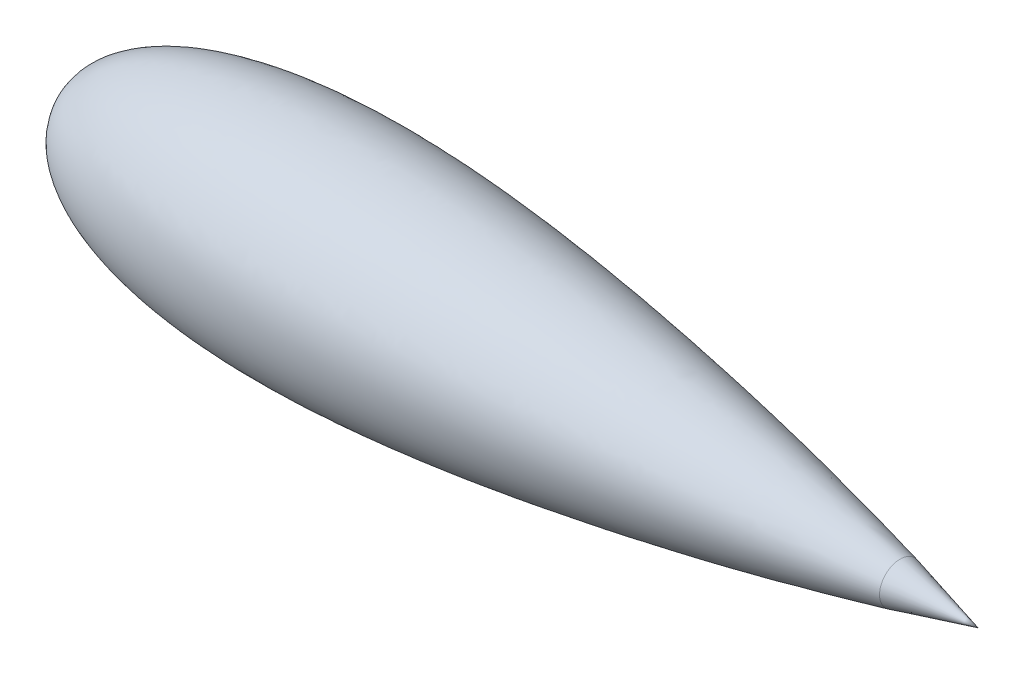
ISO-10303-21;
HEADER;
FILE_DESCRIPTION(('STEP AP214'),'2;1');
FILE_NAME('part.step','',(''),(''),'','','');
FILE_SCHEMA(('AUTOMOTIVE_DESIGN { 1 0 10303 214 1 1 1 1 }'));
ENDSEC;
DATA;
#1=APPLICATION_CONTEXT('core data for automotive mechanical design processes');
#2=APPLICATION_PROTOCOL_DEFINITION('international standard','automotive_design',2000,#1);
#3=PRODUCT_CONTEXT('',#1,'mechanical');
#4=PRODUCT('Part','Part','',(#3));
#5=PRODUCT_RELATED_PRODUCT_CATEGORY('part','',(#4));
#6=PRODUCT_DEFINITION_FORMATION('','',#4);
#7=PRODUCT_DEFINITION_CONTEXT('part definition',#1,'design');
#8=PRODUCT_DEFINITION('design','',#6,#7);
#9=PRODUCT_DEFINITION_SHAPE('','',#8);
#10=(LENGTH_UNIT() NAMED_UNIT(*) SI_UNIT(.MILLI.,.METRE.));
#11=(NAMED_UNIT(*) PLANE_ANGLE_UNIT() SI_UNIT($,.RADIAN.));
#12=(NAMED_UNIT(*) SI_UNIT($,.STERADIAN.) SOLID_ANGLE_UNIT());
#13=UNCERTAINTY_MEASURE_WITH_UNIT(LENGTH_MEASURE(1.E-05),#10,'distance_accuracy_value','');
#14=(GEOMETRIC_REPRESENTATION_CONTEXT(3) GLOBAL_UNCERTAINTY_ASSIGNED_CONTEXT((#13)) GLOBAL_UNIT_ASSIGNED_CONTEXT((#10,
#11,#12)) REPRESENTATION_CONTEXT('',''));
#15=CARTESIAN_POINT('',(0.,0.,0.));
#16=DIRECTION('',(0.,0.,1.));
#17=DIRECTION('',(1.,0.,0.));
#18=AXIS2_PLACEMENT_3D('',#15,#16,#17);
#19=CARTESIAN_POINT('',(50.,-0.1106,0.));
#20=CARTESIAN_POINT('',(49.1671944497116,-0.311191456944333,0.));
#21=CARTESIAN_POINT('',(47.5040368853807,-0.711783406459571,0.));
#22=CARTESIAN_POINT('',(44.1740196426468,-1.45693422289828,0.));
#23=CARTESIAN_POINT('',(40.0109271057626,-2.31247347990824,0.));
#24=CARTESIAN_POINT('',(35.0101609561204,-3.22439780411584,0.));
#25=CARTESIAN_POINT('',(30.0103286106349,-4.01539093064351,0.));
#26=CARTESIAN_POINT('',(25.0103922244817,-4.66194743266262,0.));
#27=CARTESIAN_POINT('',(20.0089094291449,-5.12147264607074,0.));
#28=CARTESIAN_POINT('',(15.8342709347158,-5.28340969282519,0.));
#29=CARTESIAN_POINT('',(12.4972430374259,-5.21968964873456,0.));
#30=CARTESIAN_POINT('',(9.99178007274318,-5.04617040654494,0.));
#31=CARTESIAN_POINT('',(7.47986661300778,-4.71200133855341,0.));
#32=CARTESIAN_POINT('',(5.39069622499993,-4.24308253772838,0.));
#33=CARTESIAN_POINT('',(3.72600306125581,-3.68864387740044,0.));
#34=CARTESIAN_POINT('',(2.44813994506641,-3.12297570724821,0.));
#35=CARTESIAN_POINT('',(1.38112329811806,-2.44549989828193,0.));
#36=CARTESIAN_POINT('',(0.385297698110445,-1.48293996732321,0.));
#37=CARTESIAN_POINT('',(-0.256624235847495,0.,0.));
#38=CARTESIAN_POINT('',(0.385297698110446,1.48293996732321,0.));
#39=CARTESIAN_POINT('',(1.38112329811806,2.44549989828193,0.));
#40=CARTESIAN_POINT('',(2.44813994506641,3.12297570724821,0.));
#41=CARTESIAN_POINT('',(3.7260030612558,3.68864387740044,0.));
#42=CARTESIAN_POINT('',(5.39069622499994,4.24308253772838,0.));
#43=CARTESIAN_POINT('',(7.47986661300778,4.71200133855341,0.));
#44=CARTESIAN_POINT('',(9.99178007274319,5.04617040654494,0.));
#45=CARTESIAN_POINT('',(12.4972430374259,5.21968964873455,0.));
#46=CARTESIAN_POINT('',(15.8342709347159,5.28340969282519,0.));
#47=CARTESIAN_POINT('',(20.0089094291449,5.12147264607074,0.));
#48=CARTESIAN_POINT('',(25.0103922244817,4.66194743266262,0.));
#49=CARTESIAN_POINT('',(30.0103286106349,4.01539093064351,0.));
#50=CARTESIAN_POINT('',(35.0101609561204,3.22439780411584,0.));
#51=CARTESIAN_POINT('',(40.0109271057626,2.31247347990824,0.));
#52=CARTESIAN_POINT('',(44.1740196426468,1.45693422289828,0.));
#53=CARTESIAN_POINT('',(47.5040368853808,0.711783406459571,0.));
#54=CARTESIAN_POINT('',(49.1671944497117,0.311191456944333,0.));
#55=CARTESIAN_POINT('',(50.,0.1106,0.));
#56=B_SPLINE_CURVE_WITH_KNOTS('',3,(#19,#20,#21,#22,#23,#24,#25,#26,#27,#28,#29,#30,#31,#32,#33,
#34,#35,#36,#37,#38,#39,#40,#41,#42,#43,#44,#45,#46,#47,#48,#49,#50,#51,#52,#53,#54,#55),
.UNSPECIFIED.,.F.,.F.,(4,1,1,1,1,1,1,1,1,1,1,1,1,1,1,1,1,1,1,1,1,1,1,1,1,1,1,1,1,1,1,1,1,1,4),
(0.,0.0245273453168031,0.0489824303914314,0.0977029305950028,0.146209787619413,
0.194518753147635,0.242628743212948,0.290539866377331,0.338290353257976,0.362156479891726,
0.386078089335791,0.410162484772612,0.434657725861303,0.447250001309176,0.460342159053561,
0.474623659707708,0.483098305626916,0.5,0.516901694373084,0.525376340292292,0.539657840946439,
0.552749998690824,0.565342274138697,0.589837515227388,0.613921910664209,0.637843520108274,
0.661709646742024,0.709460133622669,0.757371256787052,0.805481246852365,0.853790212380587,
0.902297069404997,0.951017569608569,0.975472654683197,1.),.UNSPECIFIED.);
#57=CARTESIAN_POINT('',(-5.13716070496305,1.74767451622135E-11,0.));
#58=DIRECTION('',(-1.,2.49002377965418E-13,0.));
#59=AXIS1_PLACEMENT('',#57,#58);
#60=SURFACE_OF_REVOLUTION('',#56,#59);
#61=CARTESIAN_POINT('',(50.,3.74746103241631E-12,0.));
#62=DIRECTION('',(-1.,2.49002377965418E-13,0.));
#63=DIRECTION('',(-2.49002377965418E-13,-1.,0.));
#64=AXIS2_PLACEMENT_3D('',#61,#62,#63);
#65=CIRCLE('',#64,0.110599999996253);
#66=CARTESIAN_POINT('',(50.,-0.110599999992505,0.));
#67=VERTEX_POINT('',#66);
#68=EDGE_CURVE('E43',#67,#67,#65,.T.);
#69=ORIENTED_EDGE('',*,*,#68,.F.);
#70=EDGE_LOOP('',(#69));
#71=FACE_BOUND('',#70,.T.);
#72=CARTESIAN_POINT('',(1.03574260927673,1.59396775580172E-11,0.));
#73=DIRECTION('',(-1.,2.49002377965418E-13,0.));
#74=DIRECTION('',(-2.49002377965418E-13,-1.,0.));
#75=AXIS2_PLACEMENT_3D('',#72,#73,#74);
#76=CIRCLE('',#75,2.09999999998406);
#77=CARTESIAN_POINT('',(1.03574260927621,-2.09999999996812,0.));
#78=VERTEX_POINT('',#77);
#79=EDGE_CURVE('E38',#78,#78,#76,.F.);
#80=ORIENTED_EDGE('',*,*,#79,.F.);
#81=EDGE_LOOP('',(#80));
#82=FACE_BOUND('',#81,.T.);
#83=ADVANCED_FACE('F34',(#71,#82),#60,.T.);
#84=CARTESIAN_POINT('',(50.,3.74746103241631E-12,0.));
#85=DIRECTION('',(-1.,2.49002377965418E-13,0.));
#86=DIRECTION('',(-2.49002377965418E-13,-1.,0.));
#87=AXIS2_PLACEMENT_3D('',#84,#85,#86);
#88=CONICAL_SURFACE('',#87,0.110599999996253,0.239122859656041);
#89=CARTESIAN_POINT('',(50.4536742899404,-1.71644622137425E-10,0.));
#90=VERTEX_POINT('',#89);
#91=VERTEX_LOOP('',#90);
#92=FACE_BOUND('',#91,.T.);
#93=ORIENTED_EDGE('',*,*,#68,.T.);
#94=EDGE_LOOP('',(#93));
#95=FACE_BOUND('',#94,.T.);
#96=ADVANCED_FACE('F49',(#92,#95),#88,.F.);
#97=CARTESIAN_POINT('',(12.,0.,0.));
#98=DIRECTION('',(-1.,0.,0.));
#99=DIRECTION('',(0.,0.,1.));
#100=AXIS2_PLACEMENT_3D('',#97,#98,#99);
#101=CYLINDRICAL_SURFACE('',#100,2.1);
#102=ORIENTED_EDGE('',*,*,#79,.T.);
#103=EDGE_LOOP('',(#102));
#104=FACE_BOUND('',#103,.T.);
#105=CARTESIAN_POINT('',(-0.533365435963833,1.63303891925668E-11,0.));
#106=DIRECTION('',(-1.,2.49002377965418E-13,0.));
#107=DIRECTION('',(-2.49002377965418E-13,-1.,0.));
#108=AXIS2_PLACEMENT_3D('',#105,#106,#107);
#109=CIRCLE('',#108,2.09999999998367);
#110=CARTESIAN_POINT('',(-0.533365435964356,-2.09999999996734,0.));
#111=VERTEX_POINT('',#110);
#112=EDGE_CURVE('E57',#111,#111,#109,.T.);
#113=ORIENTED_EDGE('',*,*,#112,.T.);
#114=EDGE_LOOP('',(#113));
#115=FACE_BOUND('',#114,.T.);
#116=ADVANCED_FACE('F52',(#104,#115),#101,.F.);
#117=CARTESIAN_POINT('',(50.2809986465992,1.27723608747947,0.));
#118=CARTESIAN_POINT('',(48.1478964065841,1.7910199905619,0.));
#119=CARTESIAN_POINT('',(43.8705774318043,2.77378647098219,0.));
#120=CARTESIAN_POINT('',(37.4079271713834,4.03274724413455,0.));
#121=CARTESIAN_POINT('',(30.911041321076,5.11181788695962,0.));
#122=CARTESIAN_POINT('',(25.4579277841148,5.82097831848089,0.));
#123=CARTESIAN_POINT('',(21.0641846932781,6.22389139114268,0.));
#124=CARTESIAN_POINT('',(17.7505056603349,6.41966913627206,0.));
#125=CARTESIAN_POINT('',(14.4204913387692,6.47876551026049,0.));
#126=CARTESIAN_POINT('',(11.0707934489349,6.35856156117959,0.));
#127=CARTESIAN_POINT('',(8.27114952757997,6.05303837118858,0.));
#128=CARTESIAN_POINT('',(6.02900271125863,5.62486265759986,0.));
#129=CARTESIAN_POINT('',(4.35391750798542,5.18164075216751,0.));
#130=CARTESIAN_POINT('',(2.69419452563164,4.58227546778914,0.));
#131=CARTESIAN_POINT('',(1.31837612829158,3.8591977985816,0.));
#132=CARTESIAN_POINT('',(0.293556688957977,3.08507696209017,0.));
#133=CARTESIAN_POINT('',(-0.463457376588678,2.287498320485,0.));
#134=CARTESIAN_POINT('',(-0.935055127608582,1.42283027012847,0.));
#135=CARTESIAN_POINT('',(-1.15661810423168,0.642748024427647,0.));
#136=CARTESIAN_POINT('',(-1.19999999999973,0.21179367942273,0.));
#137=CARTESIAN_POINT('',(-1.2,4.08242906911495E-12,0.));
#138=B_SPLINE_CURVE_WITH_KNOTS('',3,(#117,#118,#119,#120,#121,#122,#123,#124,#125,#126,#127,
#128,#129,#130,#131,#132,#133,#134,#135,#136,#137),.UNSPECIFIED.,.F.,.F.,(4,1,1,1,1,1,1,1,1,1,1,
1,1,1,1,1,1,1,4),(0.,0.0625,0.125,0.1875,0.25,0.28125,0.3125,0.34375,0.375,0.40625,0.421875,
0.4375,0.453125,0.46875,0.4765625,0.484375,0.4921875,0.49609375,0.5),.UNSPECIFIED.);
#139=CARTESIAN_POINT('',(-5.13716070496305,1.74767451622135E-11,0.));
#140=DIRECTION('',(-1.,2.49002377965418E-13,0.));
#141=AXIS1_PLACEMENT('',#139,#140);
#142=SURFACE_OF_REVOLUTION('',#138,#141);
#143=CARTESIAN_POINT('',(50.2809986465989,3.67749170120811E-12,0.));
#144=DIRECTION('',(-1.,2.49002377965418E-13,0.));
#145=DIRECTION('',(-2.49002377965418E-13,-1.,0.));
#146=AXIS2_PLACEMENT_3D('',#143,#144,#145);
#147=CIRCLE('',#146,1.27723608747579);
#148=CARTESIAN_POINT('',(50.2809986465986,-1.27723608747212,0.));
#149=VERTEX_POINT('',#148);
#150=EDGE_CURVE('E11',#149,#149,#147,.T.);
#151=ORIENTED_EDGE('',*,*,#150,.T.);
#152=EDGE_LOOP('',(#151));
#153=FACE_BOUND('',#152,.T.);
#154=ORIENTED_EDGE('',*,*,#112,.F.);
#155=EDGE_LOOP('',(#154));
#156=FACE_BOUND('',#155,.T.);
#157=ADVANCED_FACE('F71',(#153,#156),#142,.T.);
#158=CARTESIAN_POINT('',(55.119085664046,2.47279652906016E-12,0.));
#159=DIRECTION('',(-1.,2.49002377965418E-13,0.));
#160=DIRECTION('',(-2.49002377965418E-13,-1.,0.));
#161=AXIS2_PLACEMENT_3D('',#158,#159,#160);
#162=CONICAL_SURFACE('',#161,1.89989261177342E-10,0.258107467241487);
#163=ORIENTED_EDGE('',*,*,#150,.F.);
#164=EDGE_LOOP('',(#163));
#165=FACE_BOUND('',#164,.T.);
#166=CARTESIAN_POINT('',(55.119085664046,-1.87516464648282E-10,0.));
#167=VERTEX_POINT('',#166);
#168=VERTEX_LOOP('',#167);
#169=FACE_BOUND('',#168,.T.);
#170=ADVANCED_FACE('F74',(#165,#169),#162,.T.);
#171=CLOSED_SHELL('',(#83,#96,#116,#157,#170));
#172=MANIFOLD_SOLID_BREP('B2',#171);
#173=ADVANCED_BREP_SHAPE_REPRESENTATION('',(#18,#172),#14);
#174=SHAPE_DEFINITION_REPRESENTATION(#9,#173);
ENDSEC;
END-ISO-10303-21;
